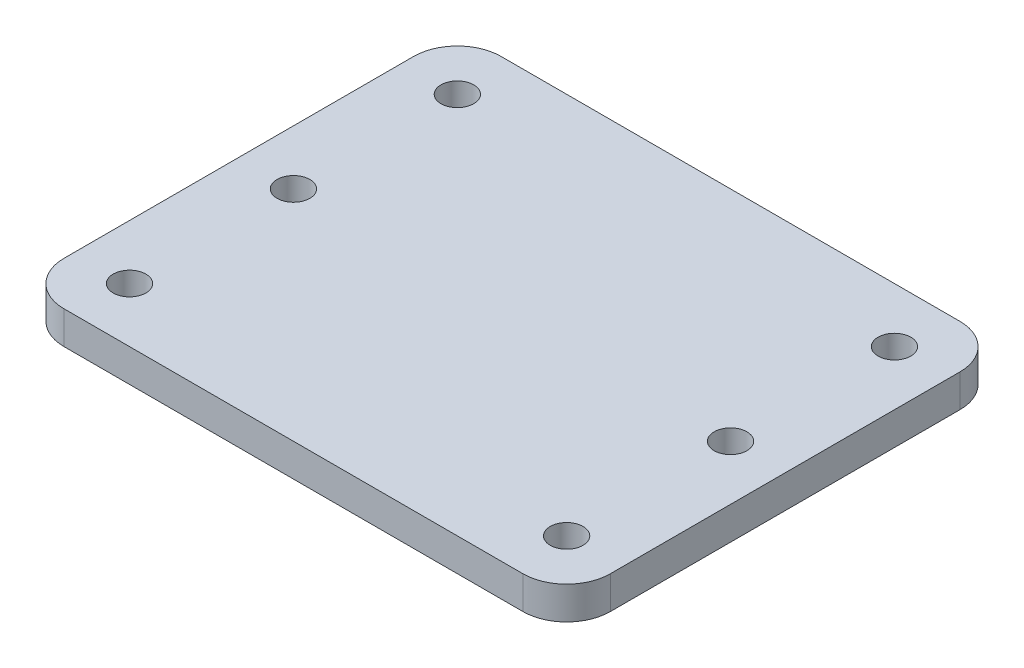
ISO-10303-21;
HEADER;
FILE_DESCRIPTION(('STEP AP214'),'2;1');
FILE_NAME('part.step','',(''),(''),'','','');
FILE_SCHEMA(('AUTOMOTIVE_DESIGN { 1 0 10303 214 1 1 1 1 }'));
ENDSEC;
DATA;
#1=APPLICATION_CONTEXT('core data for automotive mechanical design processes');
#2=APPLICATION_PROTOCOL_DEFINITION('international standard','automotive_design',2000,#1);
#3=PRODUCT_CONTEXT('',#1,'mechanical');
#4=PRODUCT('Part','Part','',(#3));
#5=PRODUCT_RELATED_PRODUCT_CATEGORY('part','',(#4));
#6=PRODUCT_DEFINITION_FORMATION('','',#4);
#7=PRODUCT_DEFINITION_CONTEXT('part definition',#1,'design');
#8=PRODUCT_DEFINITION('design','',#6,#7);
#9=PRODUCT_DEFINITION_SHAPE('','',#8);
#10=(LENGTH_UNIT() NAMED_UNIT(*) SI_UNIT(.MILLI.,.METRE.));
#11=(NAMED_UNIT(*) PLANE_ANGLE_UNIT() SI_UNIT($,.RADIAN.));
#12=(NAMED_UNIT(*) SI_UNIT($,.STERADIAN.) SOLID_ANGLE_UNIT());
#13=UNCERTAINTY_MEASURE_WITH_UNIT(LENGTH_MEASURE(1.E-05),#10,'distance_accuracy_value','');
#14=(GEOMETRIC_REPRESENTATION_CONTEXT(3) GLOBAL_UNCERTAINTY_ASSIGNED_CONTEXT((#13)) GLOBAL_UNIT_ASSIGNED_CONTEXT((#10,
#11,#12)) REPRESENTATION_CONTEXT('',''));
#15=CARTESIAN_POINT('',(0.,0.,0.));
#16=DIRECTION('',(0.,0.,1.));
#17=DIRECTION('',(1.,0.,0.));
#18=AXIS2_PLACEMENT_3D('',#15,#16,#17);
#19=CARTESIAN_POINT('',(25.,3.,-20.));
#20=DIRECTION('',(-1.,0.,0.));
#21=DIRECTION('',(0.,0.,1.));
#22=AXIS2_PLACEMENT_3D('',#19,#20,#21);
#23=PLANE('',#22);
#24=DIRECTION('',(0.,0.,-1.));
#25=VECTOR('',#24,1.);
#26=CARTESIAN_POINT('',(25.,3.,-20.));
#27=LINE('',#26,#25);
#28=CARTESIAN_POINT('',(25.,3.,16.));
#29=VERTEX_POINT('',#28);
#30=CARTESIAN_POINT('',(25.,3.,-16.));
#31=VERTEX_POINT('',#30);
#32=EDGE_CURVE('E120',#29,#31,#27,.T.);
#33=ORIENTED_EDGE('',*,*,#32,.F.);
#34=DIRECTION('',(0.,-1.,0.));
#35=VECTOR('',#34,1.);
#36=CARTESIAN_POINT('',(25.,3.,16.));
#37=LINE('',#36,#35);
#38=CARTESIAN_POINT('',(25.,0.,16.));
#39=VERTEX_POINT('',#38);
#40=EDGE_CURVE('E105',#29,#39,#37,.T.);
#41=ORIENTED_EDGE('',*,*,#40,.T.);
#42=DIRECTION('',(0.,0.,-1.));
#43=VECTOR('',#42,1.);
#44=CARTESIAN_POINT('',(25.,0.,-20.));
#45=LINE('',#44,#43);
#46=CARTESIAN_POINT('',(25.,0.,-16.));
#47=VERTEX_POINT('',#46);
#48=EDGE_CURVE('E117',#39,#47,#45,.T.);
#49=ORIENTED_EDGE('',*,*,#48,.T.);
#50=DIRECTION('',(0.,-1.,0.));
#51=VECTOR('',#50,1.);
#52=CARTESIAN_POINT('',(25.,3.,-16.));
#53=LINE('',#52,#51);
#54=EDGE_CURVE('E122',#47,#31,#53,.F.);
#55=ORIENTED_EDGE('',*,*,#54,.T.);
#56=EDGE_LOOP('',(#33,#41,#49,#55));
#57=FACE_BOUND('',#56,.T.);
#58=ADVANCED_FACE('F35',(#57),#23,.F.);
#59=CARTESIAN_POINT('',(-25.,3.,-20.));
#60=DIRECTION('',(0.,0.,1.));
#61=DIRECTION('',(1.,0.,0.));
#62=AXIS2_PLACEMENT_3D('',#59,#60,#61);
#63=PLANE('',#62);
#64=DIRECTION('',(-1.,0.,0.));
#65=VECTOR('',#64,1.);
#66=CARTESIAN_POINT('',(-25.,3.,-20.));
#67=LINE('',#66,#65);
#68=CARTESIAN_POINT('',(21.,3.,-20.));
#69=VERTEX_POINT('',#68);
#70=CARTESIAN_POINT('',(-21.,3.,-20.));
#71=VERTEX_POINT('',#70);
#72=EDGE_CURVE('E166',#69,#71,#67,.T.);
#73=ORIENTED_EDGE('',*,*,#72,.F.);
#74=DIRECTION('',(0.,-1.,0.));
#75=VECTOR('',#74,1.);
#76=CARTESIAN_POINT('',(21.,3.,-20.));
#77=LINE('',#76,#75);
#78=CARTESIAN_POINT('',(21.,0.,-20.));
#79=VERTEX_POINT('',#78);
#80=EDGE_CURVE('E159',#69,#79,#77,.T.);
#81=ORIENTED_EDGE('',*,*,#80,.T.);
#82=DIRECTION('',(-1.,0.,0.));
#83=VECTOR('',#82,1.);
#84=CARTESIAN_POINT('',(-25.,0.,-20.));
#85=LINE('',#84,#83);
#86=CARTESIAN_POINT('',(-21.,0.,-20.));
#87=VERTEX_POINT('',#86);
#88=EDGE_CURVE('E126',#79,#87,#85,.T.);
#89=ORIENTED_EDGE('',*,*,#88,.T.);
#90=DIRECTION('',(0.,-1.,0.));
#91=VECTOR('',#90,1.);
#92=CARTESIAN_POINT('',(-21.,3.,-20.));
#93=LINE('',#92,#91);
#94=EDGE_CURVE('E157',#87,#71,#93,.F.);
#95=ORIENTED_EDGE('',*,*,#94,.T.);
#96=EDGE_LOOP('',(#73,#81,#89,#95));
#97=FACE_BOUND('',#96,.T.);
#98=ADVANCED_FACE('F164',(#97),#63,.F.);
#99=CARTESIAN_POINT('',(-25.,3.,-20.));
#100=DIRECTION('',(1.,0.,0.));
#101=DIRECTION('',(0.,0.,-1.));
#102=AXIS2_PLACEMENT_3D('',#99,#100,#101);
#103=PLANE('',#102);
#104=DIRECTION('',(0.,0.,1.));
#105=VECTOR('',#104,1.);
#106=CARTESIAN_POINT('',(-25.,3.,-20.));
#107=LINE('',#106,#105);
#108=CARTESIAN_POINT('',(-25.,3.,-16.));
#109=VERTEX_POINT('',#108);
#110=CARTESIAN_POINT('',(-25.,3.,16.));
#111=VERTEX_POINT('',#110);
#112=EDGE_CURVE('E174',#109,#111,#107,.T.);
#113=ORIENTED_EDGE('',*,*,#112,.F.);
#114=DIRECTION('',(0.,-1.,0.));
#115=VECTOR('',#114,1.);
#116=CARTESIAN_POINT('',(-25.,3.,-16.));
#117=LINE('',#116,#115);
#118=CARTESIAN_POINT('',(-25.,0.,-16.));
#119=VERTEX_POINT('',#118);
#120=EDGE_CURVE('E11',#109,#119,#117,.T.);
#121=ORIENTED_EDGE('',*,*,#120,.T.);
#122=DIRECTION('',(0.,0.,1.));
#123=VECTOR('',#122,1.);
#124=CARTESIAN_POINT('',(-25.,0.,-20.));
#125=LINE('',#124,#123);
#126=CARTESIAN_POINT('',(-25.,0.,16.));
#127=VERTEX_POINT('',#126);
#128=EDGE_CURVE('E130',#119,#127,#125,.T.);
#129=ORIENTED_EDGE('',*,*,#128,.T.);
#130=DIRECTION('',(0.,-1.,0.));
#131=VECTOR('',#130,1.);
#132=CARTESIAN_POINT('',(-25.,3.,16.));
#133=LINE('',#132,#131);
#134=EDGE_CURVE('E43',#127,#111,#133,.F.);
#135=ORIENTED_EDGE('',*,*,#134,.T.);
#136=EDGE_LOOP('',(#113,#121,#129,#135));
#137=FACE_BOUND('',#136,.T.);
#138=ADVANCED_FACE('F173',(#137),#103,.F.);
#139=CARTESIAN_POINT('',(-25.,3.,20.));
#140=DIRECTION('',(0.,0.,-1.));
#141=DIRECTION('',(-1.,0.,0.));
#142=AXIS2_PLACEMENT_3D('',#139,#140,#141);
#143=PLANE('',#142);
#144=DIRECTION('',(1.,0.,0.));
#145=VECTOR('',#144,1.);
#146=CARTESIAN_POINT('',(-25.,0.,20.));
#147=LINE('',#146,#145);
#148=CARTESIAN_POINT('',(-21.,0.,20.));
#149=VERTEX_POINT('',#148);
#150=CARTESIAN_POINT('',(21.,0.,20.));
#151=VERTEX_POINT('',#150);
#152=EDGE_CURVE('E140',#149,#151,#147,.T.);
#153=ORIENTED_EDGE('',*,*,#152,.T.);
#154=DIRECTION('',(0.,-1.,0.));
#155=VECTOR('',#154,1.);
#156=CARTESIAN_POINT('',(21.,3.,20.));
#157=LINE('',#156,#155);
#158=CARTESIAN_POINT('',(21.,3.,20.));
#159=VERTEX_POINT('',#158);
#160=EDGE_CURVE('E106',#151,#159,#157,.F.);
#161=ORIENTED_EDGE('',*,*,#160,.T.);
#162=DIRECTION('',(1.,0.,0.));
#163=VECTOR('',#162,1.);
#164=CARTESIAN_POINT('',(-25.,3.,20.));
#165=LINE('',#164,#163);
#166=CARTESIAN_POINT('',(-21.,3.,20.));
#167=VERTEX_POINT('',#166);
#168=EDGE_CURVE('E136',#167,#159,#165,.T.);
#169=ORIENTED_EDGE('',*,*,#168,.F.);
#170=DIRECTION('',(0.,-1.,0.));
#171=VECTOR('',#170,1.);
#172=CARTESIAN_POINT('',(-21.,3.,20.));
#173=LINE('',#172,#171);
#174=EDGE_CURVE('E111',#167,#149,#173,.T.);
#175=ORIENTED_EDGE('',*,*,#174,.T.);
#176=EDGE_LOOP('',(#153,#161,#169,#175));
#177=FACE_BOUND('',#176,.T.);
#178=ADVANCED_FACE('F219',(#177),#143,.F.);
#179=CARTESIAN_POINT('',(0.,3.,0.));
#180=DIRECTION('',(0.,1.,0.));
#181=DIRECTION('',(0.,0.,1.));
#182=AXIS2_PLACEMENT_3D('',#179,#180,#181);
#183=PLANE('',#182);
#184=CARTESIAN_POINT('',(-20.,3.,-15.));
#185=DIRECTION('',(0.,1.,0.));
#186=DIRECTION('',(0.,0.,1.));
#187=AXIS2_PLACEMENT_3D('',#184,#185,#186);
#188=CIRCLE('',#187,1.5);
#189=CARTESIAN_POINT('',(-20.,3.,-13.5));
#190=VERTEX_POINT('',#189);
#191=EDGE_CURVE('E198',#190,#190,#188,.T.);
#192=ORIENTED_EDGE('',*,*,#191,.F.);
#193=EDGE_LOOP('',(#192));
#194=FACE_BOUND('',#193,.T.);
#195=CARTESIAN_POINT('',(20.,3.,-15.));
#196=DIRECTION('',(0.,1.,0.));
#197=DIRECTION('',(0.,0.,1.));
#198=AXIS2_PLACEMENT_3D('',#195,#196,#197);
#199=CIRCLE('',#198,1.5);
#200=CARTESIAN_POINT('',(20.,3.,-13.5));
#201=VERTEX_POINT('',#200);
#202=EDGE_CURVE('E204',#201,#201,#199,.T.);
#203=ORIENTED_EDGE('',*,*,#202,.F.);
#204=EDGE_LOOP('',(#203));
#205=FACE_BOUND('',#204,.T.);
#206=CARTESIAN_POINT('',(20.,3.,15.));
#207=DIRECTION('',(0.,1.,0.));
#208=DIRECTION('',(0.,0.,1.));
#209=AXIS2_PLACEMENT_3D('',#206,#207,#208);
#210=CIRCLE('',#209,1.5);
#211=CARTESIAN_POINT('',(20.,3.,16.5));
#212=VERTEX_POINT('',#211);
#213=EDGE_CURVE('E192',#212,#212,#210,.T.);
#214=ORIENTED_EDGE('',*,*,#213,.F.);
#215=EDGE_LOOP('',(#214));
#216=FACE_BOUND('',#215,.T.);
#217=CARTESIAN_POINT('',(-20.,3.,15.));
#218=DIRECTION('',(0.,1.,0.));
#219=DIRECTION('',(0.,0.,1.));
#220=AXIS2_PLACEMENT_3D('',#217,#218,#219);
#221=CIRCLE('',#220,1.5);
#222=CARTESIAN_POINT('',(-20.,3.,16.5));
#223=VERTEX_POINT('',#222);
#224=EDGE_CURVE('E184',#223,#223,#221,.T.);
#225=ORIENTED_EDGE('',*,*,#224,.F.);
#226=EDGE_LOOP('',(#225));
#227=FACE_BOUND('',#226,.T.);
#228=CARTESIAN_POINT('',(-20.,3.,0.));
#229=DIRECTION('',(0.,1.,0.));
#230=DIRECTION('',(0.,0.,1.));
#231=AXIS2_PLACEMENT_3D('',#228,#229,#230);
#232=CIRCLE('',#231,1.5);
#233=CARTESIAN_POINT('',(-20.,3.,1.5));
#234=VERTEX_POINT('',#233);
#235=EDGE_CURVE('E127',#234,#234,#232,.T.);
#236=ORIENTED_EDGE('',*,*,#235,.F.);
#237=EDGE_LOOP('',(#236));
#238=FACE_BOUND('',#237,.T.);
#239=CARTESIAN_POINT('',(20.,3.,0.));
#240=DIRECTION('',(0.,1.,0.));
#241=DIRECTION('',(0.,0.,1.));
#242=AXIS2_PLACEMENT_3D('',#239,#240,#241);
#243=CIRCLE('',#242,1.5);
#244=CARTESIAN_POINT('',(20.,3.,1.5));
#245=VERTEX_POINT('',#244);
#246=EDGE_CURVE('E183',#245,#245,#243,.T.);
#247=ORIENTED_EDGE('',*,*,#246,.F.);
#248=EDGE_LOOP('',(#247));
#249=FACE_BOUND('',#248,.T.);
#250=ORIENTED_EDGE('',*,*,#168,.T.);
#251=CARTESIAN_POINT('',(21.,3.,16.));
#252=DIRECTION('',(0.,1.,0.));
#253=DIRECTION('',(0.,0.,1.));
#254=AXIS2_PLACEMENT_3D('',#251,#252,#253);
#255=CIRCLE('',#254,4.);
#256=EDGE_CURVE('E155',#159,#29,#255,.T.);
#257=ORIENTED_EDGE('',*,*,#256,.T.);
#258=ORIENTED_EDGE('',*,*,#32,.T.);
#259=CARTESIAN_POINT('',(21.,3.,-16.));
#260=DIRECTION('',(0.,1.,0.));
#261=DIRECTION('',(0.,0.,1.));
#262=AXIS2_PLACEMENT_3D('',#259,#260,#261);
#263=CIRCLE('',#262,4.);
#264=EDGE_CURVE('E153',#31,#69,#263,.T.);
#265=ORIENTED_EDGE('',*,*,#264,.T.);
#266=ORIENTED_EDGE('',*,*,#72,.T.);
#267=CARTESIAN_POINT('',(-21.,3.,-16.));
#268=DIRECTION('',(0.,1.,0.));
#269=DIRECTION('',(0.,0.,1.));
#270=AXIS2_PLACEMENT_3D('',#267,#268,#269);
#271=CIRCLE('',#270,4.);
#272=EDGE_CURVE('E56',#71,#109,#271,.T.);
#273=ORIENTED_EDGE('',*,*,#272,.T.);
#274=ORIENTED_EDGE('',*,*,#112,.T.);
#275=CARTESIAN_POINT('',(-21.,3.,16.));
#276=DIRECTION('',(0.,1.,0.));
#277=DIRECTION('',(0.,0.,1.));
#278=AXIS2_PLACEMENT_3D('',#275,#276,#277);
#279=CIRCLE('',#278,4.);
#280=EDGE_CURVE('E150',#111,#167,#279,.T.);
#281=ORIENTED_EDGE('',*,*,#280,.T.);
#282=EDGE_LOOP('',(#250,#257,#258,#265,#266,#273,#274,#281));
#283=FACE_BOUND('',#282,.T.);
#284=ADVANCED_FACE('F216',(#194,#205,#216,#227,#238,#249,#283),#183,.T.);
#285=CARTESIAN_POINT('',(0.,0.,0.));
#286=DIRECTION('',(0.,1.,0.));
#287=DIRECTION('',(0.,0.,1.));
#288=AXIS2_PLACEMENT_3D('',#285,#286,#287);
#289=PLANE('',#288);
#290=CARTESIAN_POINT('',(-20.,0.,-15.));
#291=DIRECTION('',(0.,1.,0.));
#292=DIRECTION('',(0.,0.,1.));
#293=AXIS2_PLACEMENT_3D('',#290,#291,#292);
#294=CIRCLE('',#293,1.5);
#295=CARTESIAN_POINT('',(-20.,0.,-13.5));
#296=VERTEX_POINT('',#295);
#297=EDGE_CURVE('E195',#296,#296,#294,.T.);
#298=ORIENTED_EDGE('',*,*,#297,.T.);
#299=EDGE_LOOP('',(#298));
#300=FACE_BOUND('',#299,.T.);
#301=CARTESIAN_POINT('',(20.,0.,-15.));
#302=DIRECTION('',(0.,1.,0.));
#303=DIRECTION('',(0.,0.,1.));
#304=AXIS2_PLACEMENT_3D('',#301,#302,#303);
#305=CIRCLE('',#304,1.5);
#306=CARTESIAN_POINT('',(20.,0.,-13.5));
#307=VERTEX_POINT('',#306);
#308=EDGE_CURVE('E201',#307,#307,#305,.T.);
#309=ORIENTED_EDGE('',*,*,#308,.T.);
#310=EDGE_LOOP('',(#309));
#311=FACE_BOUND('',#310,.T.);
#312=CARTESIAN_POINT('',(20.,0.,15.));
#313=DIRECTION('',(0.,1.,0.));
#314=DIRECTION('',(0.,0.,1.));
#315=AXIS2_PLACEMENT_3D('',#312,#313,#314);
#316=CIRCLE('',#315,1.5);
#317=CARTESIAN_POINT('',(20.,0.,16.5));
#318=VERTEX_POINT('',#317);
#319=EDGE_CURVE('E207',#318,#318,#316,.T.);
#320=ORIENTED_EDGE('',*,*,#319,.T.);
#321=EDGE_LOOP('',(#320));
#322=FACE_BOUND('',#321,.T.);
#323=CARTESIAN_POINT('',(-20.,0.,15.));
#324=DIRECTION('',(0.,1.,0.));
#325=DIRECTION('',(0.,0.,1.));
#326=AXIS2_PLACEMENT_3D('',#323,#324,#325);
#327=CIRCLE('',#326,1.5);
#328=CARTESIAN_POINT('',(-20.,0.,16.5));
#329=VERTEX_POINT('',#328);
#330=EDGE_CURVE('E189',#329,#329,#327,.T.);
#331=ORIENTED_EDGE('',*,*,#330,.T.);
#332=EDGE_LOOP('',(#331));
#333=FACE_BOUND('',#332,.T.);
#334=CARTESIAN_POINT('',(-20.,0.,0.));
#335=DIRECTION('',(0.,1.,0.));
#336=DIRECTION('',(0.,0.,1.));
#337=AXIS2_PLACEMENT_3D('',#334,#335,#336);
#338=CIRCLE('',#337,1.5);
#339=CARTESIAN_POINT('',(-20.,0.,1.5));
#340=VERTEX_POINT('',#339);
#341=EDGE_CURVE('E133',#340,#340,#338,.T.);
#342=ORIENTED_EDGE('',*,*,#341,.T.);
#343=EDGE_LOOP('',(#342));
#344=FACE_BOUND('',#343,.T.);
#345=CARTESIAN_POINT('',(20.,0.,0.));
#346=DIRECTION('',(0.,1.,0.));
#347=DIRECTION('',(0.,0.,1.));
#348=AXIS2_PLACEMENT_3D('',#345,#346,#347);
#349=CIRCLE('',#348,1.5);
#350=CARTESIAN_POINT('',(20.,0.,1.5));
#351=VERTEX_POINT('',#350);
#352=EDGE_CURVE('E180',#351,#351,#349,.T.);
#353=ORIENTED_EDGE('',*,*,#352,.T.);
#354=EDGE_LOOP('',(#353));
#355=FACE_BOUND('',#354,.T.);
#356=ORIENTED_EDGE('',*,*,#48,.F.);
#357=CARTESIAN_POINT('',(21.,0.,16.));
#358=DIRECTION('',(0.,1.,0.));
#359=DIRECTION('',(0.,0.,1.));
#360=AXIS2_PLACEMENT_3D('',#357,#358,#359);
#361=CIRCLE('',#360,4.);
#362=EDGE_CURVE('E101',#39,#151,#361,.F.);
#363=ORIENTED_EDGE('',*,*,#362,.T.);
#364=ORIENTED_EDGE('',*,*,#152,.F.);
#365=CARTESIAN_POINT('',(-21.,0.,16.));
#366=DIRECTION('',(0.,1.,0.));
#367=DIRECTION('',(0.,0.,1.));
#368=AXIS2_PLACEMENT_3D('',#365,#366,#367);
#369=CIRCLE('',#368,4.);
#370=EDGE_CURVE('E121',#149,#127,#369,.F.);
#371=ORIENTED_EDGE('',*,*,#370,.T.);
#372=ORIENTED_EDGE('',*,*,#128,.F.);
#373=CARTESIAN_POINT('',(-21.,0.,-16.));
#374=DIRECTION('',(0.,1.,0.));
#375=DIRECTION('',(0.,0.,1.));
#376=AXIS2_PLACEMENT_3D('',#373,#374,#375);
#377=CIRCLE('',#376,4.);
#378=EDGE_CURVE('E144',#119,#87,#377,.F.);
#379=ORIENTED_EDGE('',*,*,#378,.T.);
#380=ORIENTED_EDGE('',*,*,#88,.F.);
#381=CARTESIAN_POINT('',(21.,0.,-16.));
#382=DIRECTION('',(0.,1.,0.));
#383=DIRECTION('',(0.,0.,1.));
#384=AXIS2_PLACEMENT_3D('',#381,#382,#383);
#385=CIRCLE('',#384,4.);
#386=EDGE_CURVE('E112',#79,#47,#385,.F.);
#387=ORIENTED_EDGE('',*,*,#386,.T.);
#388=EDGE_LOOP('',(#356,#363,#364,#371,#372,#379,#380,#387));
#389=FACE_BOUND('',#388,.T.);
#390=ADVANCED_FACE('F124',(#300,#311,#322,#333,#344,#355,#389),#289,.F.);
#391=CARTESIAN_POINT('',(21.,3.,16.));
#392=DIRECTION('',(0.,-1.,0.));
#393=DIRECTION('',(0.,0.,-1.));
#394=AXIS2_PLACEMENT_3D('',#391,#392,#393);
#395=CYLINDRICAL_SURFACE('',#394,4.);
#396=ORIENTED_EDGE('',*,*,#256,.F.);
#397=ORIENTED_EDGE('',*,*,#160,.F.);
#398=ORIENTED_EDGE('',*,*,#362,.F.);
#399=ORIENTED_EDGE('',*,*,#40,.F.);
#400=EDGE_LOOP('',(#396,#397,#398,#399));
#401=FACE_BOUND('',#400,.T.);
#402=ADVANCED_FACE('F104',(#401),#395,.T.);
#403=CARTESIAN_POINT('',(21.,3.,-16.));
#404=DIRECTION('',(0.,-1.,0.));
#405=DIRECTION('',(0.,0.,-1.));
#406=AXIS2_PLACEMENT_3D('',#403,#404,#405);
#407=CYLINDRICAL_SURFACE('',#406,4.);
#408=ORIENTED_EDGE('',*,*,#264,.F.);
#409=ORIENTED_EDGE('',*,*,#54,.F.);
#410=ORIENTED_EDGE('',*,*,#386,.F.);
#411=ORIENTED_EDGE('',*,*,#80,.F.);
#412=EDGE_LOOP('',(#408,#409,#410,#411));
#413=FACE_BOUND('',#412,.T.);
#414=ADVANCED_FACE('F240',(#413),#407,.T.);
#415=CARTESIAN_POINT('',(-21.,3.,-16.));
#416=DIRECTION('',(0.,-1.,0.));
#417=DIRECTION('',(0.,0.,-1.));
#418=AXIS2_PLACEMENT_3D('',#415,#416,#417);
#419=CYLINDRICAL_SURFACE('',#418,4.);
#420=ORIENTED_EDGE('',*,*,#272,.F.);
#421=ORIENTED_EDGE('',*,*,#94,.F.);
#422=ORIENTED_EDGE('',*,*,#378,.F.);
#423=ORIENTED_EDGE('',*,*,#120,.F.);
#424=EDGE_LOOP('',(#420,#421,#422,#423));
#425=FACE_BOUND('',#424,.T.);
#426=ADVANCED_FACE('F172',(#425),#419,.T.);
#427=CARTESIAN_POINT('',(-21.,3.,16.));
#428=DIRECTION('',(0.,-1.,0.));
#429=DIRECTION('',(0.,0.,-1.));
#430=AXIS2_PLACEMENT_3D('',#427,#428,#429);
#431=CYLINDRICAL_SURFACE('',#430,4.);
#432=ORIENTED_EDGE('',*,*,#280,.F.);
#433=ORIENTED_EDGE('',*,*,#134,.F.);
#434=ORIENTED_EDGE('',*,*,#370,.F.);
#435=ORIENTED_EDGE('',*,*,#174,.F.);
#436=EDGE_LOOP('',(#432,#433,#434,#435));
#437=FACE_BOUND('',#436,.T.);
#438=ADVANCED_FACE('F37',(#437),#431,.T.);
#439=CARTESIAN_POINT('',(20.,3.,0.));
#440=DIRECTION('',(0.,-1.,0.));
#441=DIRECTION('',(0.,0.,-1.));
#442=AXIS2_PLACEMENT_3D('',#439,#440,#441);
#443=CYLINDRICAL_SURFACE('',#442,1.5);
#444=ORIENTED_EDGE('',*,*,#246,.T.);
#445=EDGE_LOOP('',(#444));
#446=FACE_BOUND('',#445,.T.);
#447=ORIENTED_EDGE('',*,*,#352,.F.);
#448=EDGE_LOOP('',(#447));
#449=FACE_BOUND('',#448,.T.);
#450=ADVANCED_FACE('F232',(#446,#449),#443,.F.);
#451=CARTESIAN_POINT('',(-20.,3.,0.));
#452=DIRECTION('',(0.,-1.,0.));
#453=DIRECTION('',(0.,0.,-1.));
#454=AXIS2_PLACEMENT_3D('',#451,#452,#453);
#455=CYLINDRICAL_SURFACE('',#454,1.5);
#456=ORIENTED_EDGE('',*,*,#235,.T.);
#457=EDGE_LOOP('',(#456));
#458=FACE_BOUND('',#457,.T.);
#459=ORIENTED_EDGE('',*,*,#341,.F.);
#460=EDGE_LOOP('',(#459));
#461=FACE_BOUND('',#460,.T.);
#462=ADVANCED_FACE('F237',(#458,#461),#455,.F.);
#463=CARTESIAN_POINT('',(-20.,3.,15.));
#464=DIRECTION('',(0.,-1.,0.));
#465=DIRECTION('',(0.,0.,-1.));
#466=AXIS2_PLACEMENT_3D('',#463,#464,#465);
#467=CYLINDRICAL_SURFACE('',#466,1.5);
#468=ORIENTED_EDGE('',*,*,#224,.T.);
#469=EDGE_LOOP('',(#468));
#470=FACE_BOUND('',#469,.T.);
#471=ORIENTED_EDGE('',*,*,#330,.F.);
#472=EDGE_LOOP('',(#471));
#473=FACE_BOUND('',#472,.T.);
#474=ADVANCED_FACE('F280',(#470,#473),#467,.F.);
#475=CARTESIAN_POINT('',(20.,3.,15.));
#476=DIRECTION('',(0.,-1.,0.));
#477=DIRECTION('',(0.,0.,-1.));
#478=AXIS2_PLACEMENT_3D('',#475,#476,#477);
#479=CYLINDRICAL_SURFACE('',#478,1.5);
#480=ORIENTED_EDGE('',*,*,#213,.T.);
#481=EDGE_LOOP('',(#480));
#482=FACE_BOUND('',#481,.T.);
#483=ORIENTED_EDGE('',*,*,#319,.F.);
#484=EDGE_LOOP('',(#483));
#485=FACE_BOUND('',#484,.T.);
#486=ADVANCED_FACE('F213',(#482,#485),#479,.F.);
#487=CARTESIAN_POINT('',(20.,3.,-15.));
#488=DIRECTION('',(0.,-1.,0.));
#489=DIRECTION('',(0.,0.,-1.));
#490=AXIS2_PLACEMENT_3D('',#487,#488,#489);
#491=CYLINDRICAL_SURFACE('',#490,1.5);
#492=ORIENTED_EDGE('',*,*,#202,.T.);
#493=EDGE_LOOP('',(#492));
#494=FACE_BOUND('',#493,.T.);
#495=ORIENTED_EDGE('',*,*,#308,.F.);
#496=EDGE_LOOP('',(#495));
#497=FACE_BOUND('',#496,.T.);
#498=ADVANCED_FACE('F316',(#494,#497),#491,.F.);
#499=CARTESIAN_POINT('',(-20.,3.,-15.));
#500=DIRECTION('',(0.,-1.,0.));
#501=DIRECTION('',(0.,0.,-1.));
#502=AXIS2_PLACEMENT_3D('',#499,#500,#501);
#503=CYLINDRICAL_SURFACE('',#502,1.5);
#504=ORIENTED_EDGE('',*,*,#191,.T.);
#505=EDGE_LOOP('',(#504));
#506=FACE_BOUND('',#505,.T.);
#507=ORIENTED_EDGE('',*,*,#297,.F.);
#508=EDGE_LOOP('',(#507));
#509=FACE_BOUND('',#508,.T.);
#510=ADVANCED_FACE('F325',(#506,#509),#503,.F.);
#511=CLOSED_SHELL('',(#58,#98,#138,#178,#284,#390,#402,#414,#426,#438,#450,#462,#474,#486,#498,#510));
#512=MANIFOLD_SOLID_BREP('B2',#511);
#513=ADVANCED_BREP_SHAPE_REPRESENTATION('',(#18,#512),#14);
#514=SHAPE_DEFINITION_REPRESENTATION(#9,#513);
ENDSEC;
END-ISO-10303-21;
